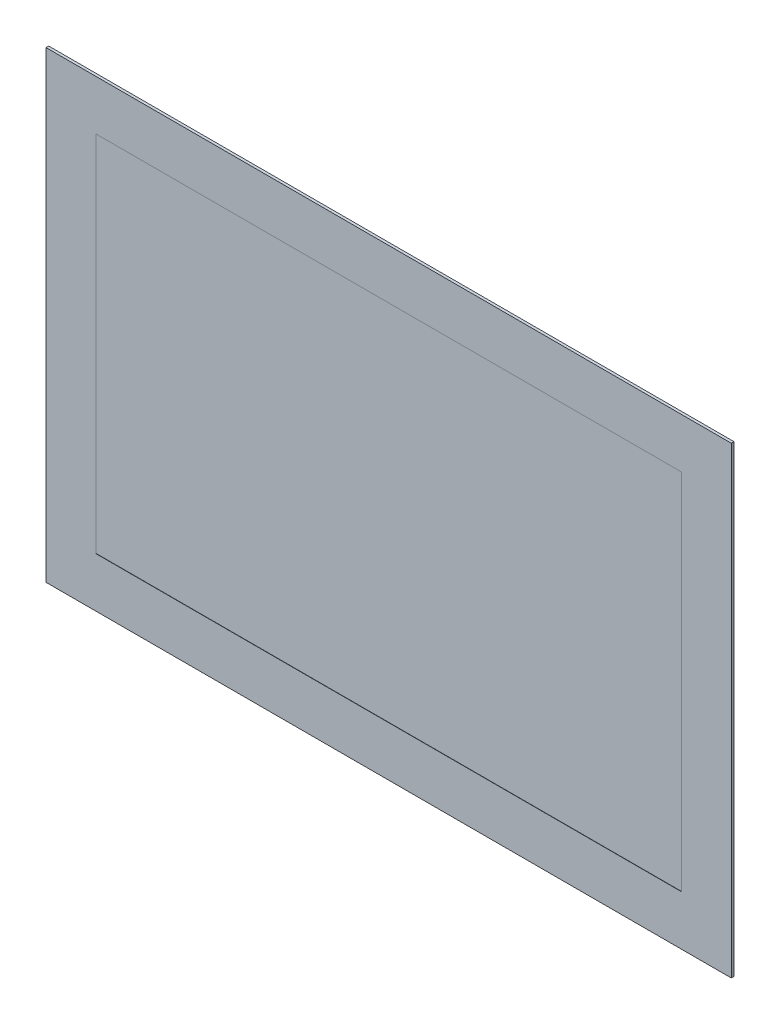
ISO-10303-21;
HEADER;
FILE_DESCRIPTION(('STEP AP214'),'2;1');
FILE_NAME('part.step','',(''),(''),'','','');
FILE_SCHEMA(('AUTOMOTIVE_DESIGN { 1 0 10303 214 1 1 1 1 }'));
ENDSEC;
DATA;
#1=APPLICATION_CONTEXT('core data for automotive mechanical design processes');
#2=APPLICATION_PROTOCOL_DEFINITION('international standard','automotive_design',2000,#1);
#3=PRODUCT_CONTEXT('',#1,'mechanical');
#4=PRODUCT('Part','Part','',(#3));
#5=PRODUCT_RELATED_PRODUCT_CATEGORY('part','',(#4));
#6=PRODUCT_DEFINITION_FORMATION('','',#4);
#7=PRODUCT_DEFINITION_CONTEXT('part definition',#1,'design');
#8=PRODUCT_DEFINITION('design','',#6,#7);
#9=PRODUCT_DEFINITION_SHAPE('','',#8);
#10=(LENGTH_UNIT() NAMED_UNIT(*) SI_UNIT(.MILLI.,.METRE.));
#11=(NAMED_UNIT(*) PLANE_ANGLE_UNIT() SI_UNIT($,.RADIAN.));
#12=(NAMED_UNIT(*) SI_UNIT($,.STERADIAN.) SOLID_ANGLE_UNIT());
#13=UNCERTAINTY_MEASURE_WITH_UNIT(LENGTH_MEASURE(1.E-05),#10,'distance_accuracy_value','');
#14=(GEOMETRIC_REPRESENTATION_CONTEXT(3) GLOBAL_UNCERTAINTY_ASSIGNED_CONTEXT((#13)) GLOBAL_UNIT_ASSIGNED_CONTEXT((#10,
#11,#12)) REPRESENTATION_CONTEXT('',''));
#15=CARTESIAN_POINT('',(0.,0.,0.));
#16=DIRECTION('',(0.,0.,1.));
#17=DIRECTION('',(1.,0.,0.));
#18=AXIS2_PLACEMENT_3D('',#15,#16,#17);
#19=CARTESIAN_POINT('',(0.,0.,0.));
#20=DIRECTION('',(0.,0.,1.));
#21=DIRECTION('',(1.,0.,0.));
#22=AXIS2_PLACEMENT_3D('',#19,#20,#21);
#23=PLANE('',#22);
#24=DIRECTION('',(0.,-1.,0.));
#25=VECTOR('',#24,1.);
#26=CARTESIAN_POINT('',(-127.25,86.,0.));
#27=LINE('',#26,#25);
#28=CARTESIAN_POINT('',(-127.25,86.,0.));
#29=VERTEX_POINT('',#28);
#30=CARTESIAN_POINT('',(-127.25,-86.,0.));
#31=VERTEX_POINT('',#30);
#32=EDGE_CURVE('E254',#29,#31,#27,.T.);
#33=ORIENTED_EDGE('',*,*,#32,.F.);
#34=DIRECTION('',(-1.,0.,0.));
#35=VECTOR('',#34,1.);
#36=CARTESIAN_POINT('',(-127.25,86.,0.));
#37=LINE('',#36,#35);
#38=CARTESIAN_POINT('',(127.25,86.,0.));
#39=VERTEX_POINT('',#38);
#40=EDGE_CURVE('E260',#39,#29,#37,.T.);
#41=ORIENTED_EDGE('',*,*,#40,.F.);
#42=DIRECTION('',(0.,1.,0.));
#43=VECTOR('',#42,1.);
#44=CARTESIAN_POINT('',(127.25,86.,0.));
#45=LINE('',#44,#43);
#46=CARTESIAN_POINT('',(127.25,-86.,0.));
#47=VERTEX_POINT('',#46);
#48=EDGE_CURVE('E276',#47,#39,#45,.T.);
#49=ORIENTED_EDGE('',*,*,#48,.F.);
#50=DIRECTION('',(1.,0.,0.));
#51=VECTOR('',#50,1.);
#52=CARTESIAN_POINT('',(-127.25,-86.,0.));
#53=LINE('',#52,#51);
#54=EDGE_CURVE('E273',#31,#47,#53,.T.);
#55=ORIENTED_EDGE('',*,*,#54,.F.);
#56=EDGE_LOOP('',(#33,#41,#49,#55));
#57=FACE_BOUND('',#56,.T.);
#58=DIRECTION('',(0.,1.,0.));
#59=VECTOR('',#58,1.);
#60=CARTESIAN_POINT('',(-115.,-76.5,0.));
#61=LINE('',#60,#59);
#62=CARTESIAN_POINT('',(-115.,-76.5,0.));
#63=VERTEX_POINT('',#62);
#64=CARTESIAN_POINT('',(-115.,71.5,0.));
#65=VERTEX_POINT('',#64);
#66=EDGE_CURVE('E64',#63,#65,#61,.T.);
#67=ORIENTED_EDGE('',*,*,#66,.F.);
#68=DIRECTION('',(-1.,0.,0.));
#69=VECTOR('',#68,1.);
#70=CARTESIAN_POINT('',(-115.,-76.5,0.));
#71=LINE('',#70,#69);
#72=CARTESIAN_POINT('',(115.,-76.5,0.));
#73=VERTEX_POINT('',#72);
#74=EDGE_CURVE('E217',#73,#63,#71,.T.);
#75=ORIENTED_EDGE('',*,*,#74,.F.);
#76=DIRECTION('',(0.,-1.,0.));
#77=VECTOR('',#76,1.);
#78=CARTESIAN_POINT('',(115.,-76.5,0.));
#79=LINE('',#78,#77);
#80=CARTESIAN_POINT('',(115.,71.5,0.));
#81=VERTEX_POINT('',#80);
#82=EDGE_CURVE('E233',#81,#73,#79,.T.);
#83=ORIENTED_EDGE('',*,*,#82,.F.);
#84=DIRECTION('',(1.,0.,0.));
#85=VECTOR('',#84,1.);
#86=CARTESIAN_POINT('',(-115.,71.5,0.));
#87=LINE('',#86,#85);
#88=EDGE_CURVE('E229',#65,#81,#87,.T.);
#89=ORIENTED_EDGE('',*,*,#88,.F.);
#90=EDGE_LOOP('',(#67,#75,#83,#89));
#91=FACE_BOUND('',#90,.T.);
#92=ADVANCED_FACE('F40',(#57,#91),#23,.F.);
#93=CARTESIAN_POINT('',(-127.25,86.,1.));
#94=DIRECTION('',(1.,0.,0.));
#95=DIRECTION('',(0.,1.,0.));
#96=AXIS2_PLACEMENT_3D('',#93,#94,#95);
#97=PLANE('',#96);
#98=ORIENTED_EDGE('',*,*,#32,.T.);
#99=DIRECTION('',(0.,0.,-1.));
#100=VECTOR('',#99,1.);
#101=CARTESIAN_POINT('',(-127.25,-86.,1.));
#102=LINE('',#101,#100);
#103=CARTESIAN_POINT('',(-127.25,-86.,1.));
#104=VERTEX_POINT('',#103);
#105=EDGE_CURVE('E11',#104,#31,#102,.T.);
#106=ORIENTED_EDGE('',*,*,#105,.F.);
#107=DIRECTION('',(0.,-1.,0.));
#108=VECTOR('',#107,1.);
#109=CARTESIAN_POINT('',(-127.25,86.,1.));
#110=LINE('',#109,#108);
#111=CARTESIAN_POINT('',(-127.25,86.,1.));
#112=VERTEX_POINT('',#111);
#113=EDGE_CURVE('E255',#112,#104,#110,.T.);
#114=ORIENTED_EDGE('',*,*,#113,.F.);
#115=DIRECTION('',(0.,0.,-1.));
#116=VECTOR('',#115,1.);
#117=CARTESIAN_POINT('',(-127.25,86.,1.));
#118=LINE('',#117,#116);
#119=EDGE_CURVE('E269',#112,#29,#118,.T.);
#120=ORIENTED_EDGE('',*,*,#119,.T.);
#121=EDGE_LOOP('',(#98,#106,#114,#120));
#122=FACE_BOUND('',#121,.T.);
#123=ADVANCED_FACE('F42',(#122),#97,.F.);
#124=CARTESIAN_POINT('',(-127.25,-86.,1.));
#125=DIRECTION('',(0.,1.,0.));
#126=DIRECTION('',(0.,0.,1.));
#127=AXIS2_PLACEMENT_3D('',#124,#125,#126);
#128=PLANE('',#127);
#129=ORIENTED_EDGE('',*,*,#54,.T.);
#130=DIRECTION('',(0.,0.,-1.));
#131=VECTOR('',#130,1.);
#132=CARTESIAN_POINT('',(127.25,-86.,1.));
#133=LINE('',#132,#131);
#134=CARTESIAN_POINT('',(127.25,-86.,1.));
#135=VERTEX_POINT('',#134);
#136=EDGE_CURVE('E49',#135,#47,#133,.T.);
#137=ORIENTED_EDGE('',*,*,#136,.F.);
#138=DIRECTION('',(1.,0.,0.));
#139=VECTOR('',#138,1.);
#140=CARTESIAN_POINT('',(-127.25,-86.,1.));
#141=LINE('',#140,#139);
#142=EDGE_CURVE('E259',#104,#135,#141,.T.);
#143=ORIENTED_EDGE('',*,*,#142,.F.);
#144=ORIENTED_EDGE('',*,*,#105,.T.);
#145=EDGE_LOOP('',(#129,#137,#143,#144));
#146=FACE_BOUND('',#145,.T.);
#147=ADVANCED_FACE('F308',(#146),#128,.F.);
#148=CARTESIAN_POINT('',(127.25,86.,1.));
#149=DIRECTION('',(-1.,0.,0.));
#150=DIRECTION('',(0.,0.,1.));
#151=AXIS2_PLACEMENT_3D('',#148,#149,#150);
#152=PLANE('',#151);
#153=ORIENTED_EDGE('',*,*,#48,.T.);
#154=DIRECTION('',(0.,0.,-1.));
#155=VECTOR('',#154,1.);
#156=CARTESIAN_POINT('',(127.25,86.,1.));
#157=LINE('',#156,#155);
#158=CARTESIAN_POINT('',(127.25,86.,1.));
#159=VERTEX_POINT('',#158);
#160=EDGE_CURVE('E284',#159,#39,#157,.T.);
#161=ORIENTED_EDGE('',*,*,#160,.F.);
#162=DIRECTION('',(0.,1.,0.));
#163=VECTOR('',#162,1.);
#164=CARTESIAN_POINT('',(127.25,86.,1.));
#165=LINE('',#164,#163);
#166=EDGE_CURVE('E263',#135,#159,#165,.T.);
#167=ORIENTED_EDGE('',*,*,#166,.F.);
#168=ORIENTED_EDGE('',*,*,#136,.T.);
#169=EDGE_LOOP('',(#153,#161,#167,#168));
#170=FACE_BOUND('',#169,.T.);
#171=ADVANCED_FACE('F293',(#170),#152,.F.);
#172=CARTESIAN_POINT('',(-127.25,86.,1.));
#173=DIRECTION('',(0.,-1.,0.));
#174=DIRECTION('',(0.,0.,-1.));
#175=AXIS2_PLACEMENT_3D('',#172,#173,#174);
#176=PLANE('',#175);
#177=ORIENTED_EDGE('',*,*,#40,.T.);
#178=ORIENTED_EDGE('',*,*,#119,.F.);
#179=DIRECTION('',(-1.,0.,0.));
#180=VECTOR('',#179,1.);
#181=CARTESIAN_POINT('',(-127.25,86.,1.));
#182=LINE('',#181,#180);
#183=EDGE_CURVE('E266',#159,#112,#182,.T.);
#184=ORIENTED_EDGE('',*,*,#183,.F.);
#185=ORIENTED_EDGE('',*,*,#160,.T.);
#186=EDGE_LOOP('',(#177,#178,#184,#185));
#187=FACE_BOUND('',#186,.T.);
#188=ADVANCED_FACE('F301',(#187),#176,.F.);
#189=CARTESIAN_POINT('',(0.,0.,1.));
#190=DIRECTION('',(0.,0.,1.));
#191=DIRECTION('',(1.,0.,0.));
#192=AXIS2_PLACEMENT_3D('',#189,#190,#191);
#193=PLANE('',#192);
#194=DIRECTION('',(0.,1.,0.));
#195=VECTOR('',#194,1.);
#196=CARTESIAN_POINT('',(108.75,-67.5,1.));
#197=LINE('',#196,#195);
#198=CARTESIAN_POINT('',(108.75,-67.5,1.));
#199=VERTEX_POINT('',#198);
#200=CARTESIAN_POINT('',(108.75,67.5,1.));
#201=VERTEX_POINT('',#200);
#202=EDGE_CURVE('E56',#199,#201,#197,.T.);
#203=ORIENTED_EDGE('',*,*,#202,.F.);
#204=DIRECTION('',(1.,0.,0.));
#205=VECTOR('',#204,1.);
#206=CARTESIAN_POINT('',(108.75,-67.5,1.));
#207=LINE('',#206,#205);
#208=CARTESIAN_POINT('',(-108.75,-67.5,1.));
#209=VERTEX_POINT('',#208);
#210=EDGE_CURVE('E153',#209,#199,#207,.T.);
#211=ORIENTED_EDGE('',*,*,#210,.F.);
#212=DIRECTION('',(0.,-1.,0.));
#213=VECTOR('',#212,1.);
#214=CARTESIAN_POINT('',(-108.75,-67.5,1.));
#215=LINE('',#214,#213);
#216=CARTESIAN_POINT('',(-108.75,67.5,1.));
#217=VERTEX_POINT('',#216);
#218=EDGE_CURVE('E157',#217,#209,#215,.T.);
#219=ORIENTED_EDGE('',*,*,#218,.F.);
#220=DIRECTION('',(-1.,0.,0.));
#221=VECTOR('',#220,1.);
#222=CARTESIAN_POINT('',(108.75,67.5,1.));
#223=LINE('',#222,#221);
#224=EDGE_CURVE('E166',#201,#217,#223,.T.);
#225=ORIENTED_EDGE('',*,*,#224,.F.);
#226=EDGE_LOOP('',(#203,#211,#219,#225));
#227=FACE_BOUND('',#226,.T.);
#228=ORIENTED_EDGE('',*,*,#113,.T.);
#229=ORIENTED_EDGE('',*,*,#142,.T.);
#230=ORIENTED_EDGE('',*,*,#166,.T.);
#231=ORIENTED_EDGE('',*,*,#183,.T.);
#232=EDGE_LOOP('',(#228,#229,#230,#231));
#233=FACE_BOUND('',#232,.T.);
#234=ADVANCED_FACE('F307',(#227,#233),#193,.T.);
#235=CARTESIAN_POINT('',(-115.,-76.5,-9.));
#236=DIRECTION('',(1.,0.,0.));
#237=DIRECTION('',(0.,1.,0.));
#238=AXIS2_PLACEMENT_3D('',#235,#236,#237);
#239=PLANE('',#238);
#240=ORIENTED_EDGE('',*,*,#66,.T.);
#241=DIRECTION('',(0.,0.,1.));
#242=VECTOR('',#241,1.);
#243=CARTESIAN_POINT('',(-115.,71.5,-9.));
#244=LINE('',#243,#242);
#245=CARTESIAN_POINT('',(-115.,71.5,-9.));
#246=VERTEX_POINT('',#245);
#247=EDGE_CURVE('E250',#246,#65,#244,.T.);
#248=ORIENTED_EDGE('',*,*,#247,.F.);
#249=DIRECTION('',(0.,1.,0.));
#250=VECTOR('',#249,1.);
#251=CARTESIAN_POINT('',(-115.,-76.5,-9.));
#252=LINE('',#251,#250);
#253=CARTESIAN_POINT('',(-115.,-76.5,-9.));
#254=VERTEX_POINT('',#253);
#255=EDGE_CURVE('E212',#254,#246,#252,.T.);
#256=ORIENTED_EDGE('',*,*,#255,.F.);
#257=DIRECTION('',(0.,0.,1.));
#258=VECTOR('',#257,1.);
#259=CARTESIAN_POINT('',(-115.,-76.5,-9.));
#260=LINE('',#259,#258);
#261=EDGE_CURVE('E226',#254,#63,#260,.T.);
#262=ORIENTED_EDGE('',*,*,#261,.T.);
#263=EDGE_LOOP('',(#240,#248,#256,#262));
#264=FACE_BOUND('',#263,.T.);
#265=ADVANCED_FACE('F327',(#264),#239,.F.);
#266=CARTESIAN_POINT('',(-115.,71.5,-9.));
#267=DIRECTION('',(0.,-1.,0.));
#268=DIRECTION('',(1.,0.,0.));
#269=AXIS2_PLACEMENT_3D('',#266,#267,#268);
#270=PLANE('',#269);
#271=ORIENTED_EDGE('',*,*,#88,.T.);
#272=DIRECTION('',(0.,0.,1.));
#273=VECTOR('',#272,1.);
#274=CARTESIAN_POINT('',(115.,71.5,-9.));
#275=LINE('',#274,#273);
#276=CARTESIAN_POINT('',(115.,71.5,-9.));
#277=VERTEX_POINT('',#276);
#278=EDGE_CURVE('E246',#277,#81,#275,.T.);
#279=ORIENTED_EDGE('',*,*,#278,.F.);
#280=DIRECTION('',(1.,0.,0.));
#281=VECTOR('',#280,1.);
#282=CARTESIAN_POINT('',(-115.,71.5,-9.));
#283=LINE('',#282,#281);
#284=EDGE_CURVE('E216',#246,#277,#283,.T.);
#285=ORIENTED_EDGE('',*,*,#284,.F.);
#286=ORIENTED_EDGE('',*,*,#247,.T.);
#287=EDGE_LOOP('',(#271,#279,#285,#286));
#288=FACE_BOUND('',#287,.T.);
#289=ADVANCED_FACE('F333',(#288),#270,.F.);
#290=CARTESIAN_POINT('',(115.,-76.5,-9.));
#291=DIRECTION('',(-1.,0.,0.));
#292=DIRECTION('',(0.,0.,1.));
#293=AXIS2_PLACEMENT_3D('',#290,#291,#292);
#294=PLANE('',#293);
#295=ORIENTED_EDGE('',*,*,#82,.T.);
#296=DIRECTION('',(0.,0.,1.));
#297=VECTOR('',#296,1.);
#298=CARTESIAN_POINT('',(115.,-76.5,-9.));
#299=LINE('',#298,#297);
#300=CARTESIAN_POINT('',(115.,-76.5,-9.));
#301=VERTEX_POINT('',#300);
#302=EDGE_CURVE('E242',#301,#73,#299,.T.);
#303=ORIENTED_EDGE('',*,*,#302,.F.);
#304=DIRECTION('',(0.,-1.,0.));
#305=VECTOR('',#304,1.);
#306=CARTESIAN_POINT('',(115.,-76.5,-9.));
#307=LINE('',#306,#305);
#308=EDGE_CURVE('E220',#277,#301,#307,.T.);
#309=ORIENTED_EDGE('',*,*,#308,.F.);
#310=ORIENTED_EDGE('',*,*,#278,.T.);
#311=EDGE_LOOP('',(#295,#303,#309,#310));
#312=FACE_BOUND('',#311,.T.);
#313=ADVANCED_FACE('F392',(#312),#294,.F.);
#314=CARTESIAN_POINT('',(-115.,-76.5,-9.));
#315=DIRECTION('',(0.,1.,0.));
#316=DIRECTION('',(-1.,0.,0.));
#317=AXIS2_PLACEMENT_3D('',#314,#315,#316);
#318=PLANE('',#317);
#319=ORIENTED_EDGE('',*,*,#74,.T.);
#320=ORIENTED_EDGE('',*,*,#261,.F.);
#321=DIRECTION('',(-1.,0.,0.));
#322=VECTOR('',#321,1.);
#323=CARTESIAN_POINT('',(-115.,-76.5,-9.));
#324=LINE('',#323,#322);
#325=EDGE_CURVE('E223',#301,#254,#324,.T.);
#326=ORIENTED_EDGE('',*,*,#325,.F.);
#327=ORIENTED_EDGE('',*,*,#302,.T.);
#328=EDGE_LOOP('',(#319,#320,#326,#327));
#329=FACE_BOUND('',#328,.T.);
#330=ADVANCED_FACE('F388',(#329),#318,.F.);
#331=CARTESIAN_POINT('',(0.,0.,-9.));
#332=DIRECTION('',(0.,0.,-1.));
#333=DIRECTION('',(-1.,0.,0.));
#334=AXIS2_PLACEMENT_3D('',#331,#332,#333);
#335=PLANE('',#334);
#336=CARTESIAN_POINT('',(-29.,-26.5,-9.));
#337=DIRECTION('',(0.,0.,-1.));
#338=DIRECTION('',(-1.,0.,0.));
#339=AXIS2_PLACEMENT_3D('',#336,#337,#338);
#340=CIRCLE('',#339,1.75);
#341=CARTESIAN_POINT('',(-30.75,-26.5,-9.));
#342=VERTEX_POINT('',#341);
#343=EDGE_CURVE('E194',#342,#342,#340,.T.);
#344=ORIENTED_EDGE('',*,*,#343,.F.);
#345=EDGE_LOOP('',(#344));
#346=FACE_BOUND('',#345,.T.);
#347=CARTESIAN_POINT('',(29.,22.5,-9.));
#348=DIRECTION('',(0.,0.,-1.));
#349=DIRECTION('',(-1.,0.,0.));
#350=AXIS2_PLACEMENT_3D('',#347,#348,#349);
#351=CIRCLE('',#350,1.75);
#352=CARTESIAN_POINT('',(27.25,22.5,-9.));
#353=VERTEX_POINT('',#352);
#354=EDGE_CURVE('E185',#353,#353,#351,.T.);
#355=ORIENTED_EDGE('',*,*,#354,.F.);
#356=EDGE_LOOP('',(#355));
#357=FACE_BOUND('',#356,.T.);
#358=CARTESIAN_POINT('',(-29.,22.5,-9.));
#359=DIRECTION('',(0.,0.,-1.));
#360=DIRECTION('',(-1.,0.,0.));
#361=AXIS2_PLACEMENT_3D('',#358,#359,#360);
#362=CIRCLE('',#361,1.75);
#363=CARTESIAN_POINT('',(-30.75,22.5,-9.));
#364=VERTEX_POINT('',#363);
#365=EDGE_CURVE('E175',#364,#364,#362,.T.);
#366=ORIENTED_EDGE('',*,*,#365,.F.);
#367=EDGE_LOOP('',(#366));
#368=FACE_BOUND('',#367,.T.);
#369=CARTESIAN_POINT('',(29.,-26.5,-9.));
#370=DIRECTION('',(0.,0.,-1.));
#371=DIRECTION('',(-1.,0.,0.));
#372=AXIS2_PLACEMENT_3D('',#369,#370,#371);
#373=CIRCLE('',#372,1.75);
#374=CARTESIAN_POINT('',(27.25,-26.5,-9.));
#375=VERTEX_POINT('',#374);
#376=EDGE_CURVE('E193',#375,#375,#373,.T.);
#377=ORIENTED_EDGE('',*,*,#376,.F.);
#378=EDGE_LOOP('',(#377));
#379=FACE_BOUND('',#378,.T.);
#380=ORIENTED_EDGE('',*,*,#255,.T.);
#381=ORIENTED_EDGE('',*,*,#284,.T.);
#382=ORIENTED_EDGE('',*,*,#308,.T.);
#383=ORIENTED_EDGE('',*,*,#325,.T.);
#384=EDGE_LOOP('',(#380,#381,#382,#383));
#385=FACE_BOUND('',#384,.T.);
#386=ADVANCED_FACE('F384',(#346,#357,#368,#379,#385),#335,.T.);
#387=CARTESIAN_POINT('',(29.,-26.5,-7.));
#388=DIRECTION('',(0.,0.,-1.));
#389=DIRECTION('',(-1.,0.,0.));
#390=AXIS2_PLACEMENT_3D('',#387,#388,#389);
#391=CYLINDRICAL_SURFACE('',#390,1.75);
#392=CARTESIAN_POINT('',(29.,-26.5,-7.));
#393=DIRECTION('',(0.,0.,-1.));
#394=DIRECTION('',(-1.,0.,0.));
#395=AXIS2_PLACEMENT_3D('',#392,#393,#394);
#396=CIRCLE('',#395,1.75);
#397=CARTESIAN_POINT('',(27.25,-26.5,-7.));
#398=VERTEX_POINT('',#397);
#399=EDGE_CURVE('E205',#398,#398,#396,.T.);
#400=ORIENTED_EDGE('',*,*,#399,.F.);
#401=EDGE_LOOP('',(#400));
#402=FACE_BOUND('',#401,.T.);
#403=ORIENTED_EDGE('',*,*,#376,.T.);
#404=EDGE_LOOP('',(#403));
#405=FACE_BOUND('',#404,.T.);
#406=ADVANCED_FACE('F380',(#402,#405),#391,.F.);
#407=CARTESIAN_POINT('',(29.,-26.5,-7.));
#408=DIRECTION('',(0.,0.,-1.));
#409=DIRECTION('',(-1.,0.,0.));
#410=AXIS2_PLACEMENT_3D('',#407,#408,#409);
#411=PLANE('',#410);
#412=ORIENTED_EDGE('',*,*,#399,.T.);
#413=EDGE_LOOP('',(#412));
#414=FACE_BOUND('',#413,.T.);
#415=ADVANCED_FACE('F362',(#414),#411,.T.);
#416=CARTESIAN_POINT('',(-29.,22.5,-7.));
#417=DIRECTION('',(0.,0.,-1.));
#418=DIRECTION('',(-1.,0.,0.));
#419=AXIS2_PLACEMENT_3D('',#416,#417,#418);
#420=CYLINDRICAL_SURFACE('',#419,1.75);
#421=CARTESIAN_POINT('',(-29.,22.5,-7.));
#422=DIRECTION('',(0.,0.,-1.));
#423=DIRECTION('',(-1.,0.,0.));
#424=AXIS2_PLACEMENT_3D('',#421,#422,#423);
#425=CIRCLE('',#424,1.75);
#426=CARTESIAN_POINT('',(-30.75,22.5,-7.));
#427=VERTEX_POINT('',#426);
#428=EDGE_CURVE('E181',#427,#427,#425,.T.);
#429=ORIENTED_EDGE('',*,*,#428,.F.);
#430=EDGE_LOOP('',(#429));
#431=FACE_BOUND('',#430,.T.);
#432=ORIENTED_EDGE('',*,*,#365,.T.);
#433=EDGE_LOOP('',(#432));
#434=FACE_BOUND('',#433,.T.);
#435=ADVANCED_FACE('F358',(#431,#434),#420,.F.);
#436=CARTESIAN_POINT('',(-29.,22.5,-7.));
#437=DIRECTION('',(0.,0.,-1.));
#438=DIRECTION('',(-1.,0.,0.));
#439=AXIS2_PLACEMENT_3D('',#436,#437,#438);
#440=PLANE('',#439);
#441=ORIENTED_EDGE('',*,*,#428,.T.);
#442=EDGE_LOOP('',(#441));
#443=FACE_BOUND('',#442,.T.);
#444=ADVANCED_FACE('F354',(#443),#440,.T.);
#445=CARTESIAN_POINT('',(29.,22.5,-7.));
#446=DIRECTION('',(0.,0.,-1.));
#447=DIRECTION('',(-1.,0.,0.));
#448=AXIS2_PLACEMENT_3D('',#445,#446,#447);
#449=CYLINDRICAL_SURFACE('',#448,1.75);
#450=CARTESIAN_POINT('',(29.,22.5,-7.));
#451=DIRECTION('',(0.,0.,-1.));
#452=DIRECTION('',(-1.,0.,0.));
#453=AXIS2_PLACEMENT_3D('',#450,#451,#452);
#454=CIRCLE('',#453,1.75);
#455=CARTESIAN_POINT('',(27.25,22.5,-7.));
#456=VERTEX_POINT('',#455);
#457=EDGE_CURVE('E198',#456,#456,#454,.T.);
#458=ORIENTED_EDGE('',*,*,#457,.F.);
#459=EDGE_LOOP('',(#458));
#460=FACE_BOUND('',#459,.T.);
#461=ORIENTED_EDGE('',*,*,#354,.T.);
#462=EDGE_LOOP('',(#461));
#463=FACE_BOUND('',#462,.T.);
#464=ADVANCED_FACE('F357',(#460,#463),#449,.F.);
#465=CARTESIAN_POINT('',(29.,22.5,-7.));
#466=DIRECTION('',(0.,0.,-1.));
#467=DIRECTION('',(-1.,0.,0.));
#468=AXIS2_PLACEMENT_3D('',#465,#466,#467);
#469=PLANE('',#468);
#470=ORIENTED_EDGE('',*,*,#457,.T.);
#471=EDGE_LOOP('',(#470));
#472=FACE_BOUND('',#471,.T.);
#473=ADVANCED_FACE('F370',(#472),#469,.T.);
#474=CARTESIAN_POINT('',(-29.,-26.5,-7.));
#475=DIRECTION('',(0.,0.,-1.));
#476=DIRECTION('',(-1.,0.,0.));
#477=AXIS2_PLACEMENT_3D('',#474,#475,#476);
#478=CYLINDRICAL_SURFACE('',#477,1.75);
#479=CARTESIAN_POINT('',(-29.,-26.5,-7.));
#480=DIRECTION('',(0.,0.,-1.));
#481=DIRECTION('',(-1.,0.,0.));
#482=AXIS2_PLACEMENT_3D('',#479,#480,#481);
#483=CIRCLE('',#482,1.75);
#484=CARTESIAN_POINT('',(-30.75,-26.5,-7.));
#485=VERTEX_POINT('',#484);
#486=EDGE_CURVE('E189',#485,#485,#483,.T.);
#487=ORIENTED_EDGE('',*,*,#486,.F.);
#488=EDGE_LOOP('',(#487));
#489=FACE_BOUND('',#488,.T.);
#490=ORIENTED_EDGE('',*,*,#343,.T.);
#491=EDGE_LOOP('',(#490));
#492=FACE_BOUND('',#491,.T.);
#493=ADVANCED_FACE('F366',(#489,#492),#478,.F.);
#494=CARTESIAN_POINT('',(-29.,-26.5,-7.));
#495=DIRECTION('',(0.,0.,-1.));
#496=DIRECTION('',(-1.,0.,0.));
#497=AXIS2_PLACEMENT_3D('',#494,#495,#496);
#498=PLANE('',#497);
#499=ORIENTED_EDGE('',*,*,#486,.T.);
#500=EDGE_LOOP('',(#499));
#501=FACE_BOUND('',#500,.T.);
#502=ADVANCED_FACE('F348',(#501),#498,.T.);
#503=CARTESIAN_POINT('',(108.75,-67.5,0.9));
#504=DIRECTION('',(1.,0.,0.));
#505=DIRECTION('',(0.,0.,-1.));
#506=AXIS2_PLACEMENT_3D('',#503,#504,#505);
#507=PLANE('',#506);
#508=ORIENTED_EDGE('',*,*,#202,.T.);
#509=DIRECTION('',(0.,0.,1.));
#510=VECTOR('',#509,1.);
#511=CARTESIAN_POINT('',(108.75,67.5,0.9));
#512=LINE('',#511,#510);
#513=CARTESIAN_POINT('',(108.75,67.5,0.9));
#514=VERTEX_POINT('',#513);
#515=EDGE_CURVE('E128',#514,#201,#512,.T.);
#516=ORIENTED_EDGE('',*,*,#515,.F.);
#517=DIRECTION('',(0.,1.,0.));
#518=VECTOR('',#517,1.);
#519=CARTESIAN_POINT('',(108.75,-67.5,0.9));
#520=LINE('',#519,#518);
#521=CARTESIAN_POINT('',(108.75,-67.5,0.9));
#522=VERTEX_POINT('',#521);
#523=EDGE_CURVE('E132',#522,#514,#520,.T.);
#524=ORIENTED_EDGE('',*,*,#523,.F.);
#525=DIRECTION('',(0.,0.,1.));
#526=VECTOR('',#525,1.);
#527=CARTESIAN_POINT('',(108.75,-67.5,0.9));
#528=LINE('',#527,#526);
#529=EDGE_CURVE('E172',#522,#199,#528,.T.);
#530=ORIENTED_EDGE('',*,*,#529,.T.);
#531=EDGE_LOOP('',(#508,#516,#524,#530));
#532=FACE_BOUND('',#531,.T.);
#533=ADVANCED_FACE('F130',(#532),#507,.F.);
#534=CARTESIAN_POINT('',(108.75,-67.5,0.9));
#535=DIRECTION('',(0.,-1.,0.));
#536=DIRECTION('',(1.,0.,0.));
#537=AXIS2_PLACEMENT_3D('',#534,#535,#536);
#538=PLANE('',#537);
#539=ORIENTED_EDGE('',*,*,#210,.T.);
#540=ORIENTED_EDGE('',*,*,#529,.F.);
#541=DIRECTION('',(1.,0.,0.));
#542=VECTOR('',#541,1.);
#543=CARTESIAN_POINT('',(108.75,-67.5,0.9));
#544=LINE('',#543,#542);
#545=CARTESIAN_POINT('',(-108.75,-67.5,0.9));
#546=VERTEX_POINT('',#545);
#547=EDGE_CURVE('E139',#546,#522,#544,.T.);
#548=ORIENTED_EDGE('',*,*,#547,.F.);
#549=DIRECTION('',(0.,0.,1.));
#550=VECTOR('',#549,1.);
#551=CARTESIAN_POINT('',(-108.75,-67.5,0.9));
#552=LINE('',#551,#550);
#553=EDGE_CURVE('E176',#546,#209,#552,.T.);
#554=ORIENTED_EDGE('',*,*,#553,.T.);
#555=EDGE_LOOP('',(#539,#540,#548,#554));
#556=FACE_BOUND('',#555,.T.);
#557=ADVANCED_FACE('F340',(#556),#538,.F.);
#558=CARTESIAN_POINT('',(-108.75,-67.5,0.9));
#559=DIRECTION('',(-1.,0.,0.));
#560=DIRECTION('',(0.,-1.,0.));
#561=AXIS2_PLACEMENT_3D('',#558,#559,#560);
#562=PLANE('',#561);
#563=ORIENTED_EDGE('',*,*,#218,.T.);
#564=ORIENTED_EDGE('',*,*,#553,.F.);
#565=DIRECTION('',(0.,-1.,0.));
#566=VECTOR('',#565,1.);
#567=CARTESIAN_POINT('',(-108.75,-67.5,0.9));
#568=LINE('',#567,#566);
#569=CARTESIAN_POINT('',(-108.75,67.5,0.9));
#570=VERTEX_POINT('',#569);
#571=EDGE_CURVE('E148',#570,#546,#568,.T.);
#572=ORIENTED_EDGE('',*,*,#571,.F.);
#573=DIRECTION('',(0.,0.,1.));
#574=VECTOR('',#573,1.);
#575=CARTESIAN_POINT('',(-108.75,67.5,0.9));
#576=LINE('',#575,#574);
#577=EDGE_CURVE('E138',#570,#217,#576,.T.);
#578=ORIENTED_EDGE('',*,*,#577,.T.);
#579=EDGE_LOOP('',(#563,#564,#572,#578));
#580=FACE_BOUND('',#579,.T.);
#581=ADVANCED_FACE('F338',(#580),#562,.F.);
#582=CARTESIAN_POINT('',(108.75,67.5,0.9));
#583=DIRECTION('',(0.,1.,0.));
#584=DIRECTION('',(-1.,0.,0.));
#585=AXIS2_PLACEMENT_3D('',#582,#583,#584);
#586=PLANE('',#585);
#587=ORIENTED_EDGE('',*,*,#224,.T.);
#588=ORIENTED_EDGE('',*,*,#577,.F.);
#589=DIRECTION('',(-1.,0.,0.));
#590=VECTOR('',#589,1.);
#591=CARTESIAN_POINT('',(108.75,67.5,0.9));
#592=LINE('',#591,#590);
#593=EDGE_CURVE('E142',#514,#570,#592,.T.);
#594=ORIENTED_EDGE('',*,*,#593,.F.);
#595=ORIENTED_EDGE('',*,*,#515,.T.);
#596=EDGE_LOOP('',(#587,#588,#594,#595));
#597=FACE_BOUND('',#596,.T.);
#598=ADVANCED_FACE('F143',(#597),#586,.F.);
#599=CARTESIAN_POINT('',(0.,0.,0.9));
#600=DIRECTION('',(0.,0.,1.));
#601=DIRECTION('',(1.,0.,0.));
#602=AXIS2_PLACEMENT_3D('',#599,#600,#601);
#603=PLANE('',#602);
#604=ORIENTED_EDGE('',*,*,#523,.T.);
#605=ORIENTED_EDGE('',*,*,#593,.T.);
#606=ORIENTED_EDGE('',*,*,#571,.T.);
#607=ORIENTED_EDGE('',*,*,#547,.T.);
#608=EDGE_LOOP('',(#604,#605,#606,#607));
#609=FACE_BOUND('',#608,.T.);
#610=ADVANCED_FACE('F150',(#609),#603,.T.);
#611=CLOSED_SHELL('',(#92,#123,#147,#171,#188,#234,#265,#289,#313,#330,#386,#406,#415,#435,#444,
#464,#473,#493,#502,#533,#557,#581,#598,#610));
#612=MANIFOLD_SOLID_BREP('B2',#611);
#613=ADVANCED_BREP_SHAPE_REPRESENTATION('',(#18,#612),#14);
#614=SHAPE_DEFINITION_REPRESENTATION(#9,#613);
ENDSEC;
END-ISO-10303-21;
